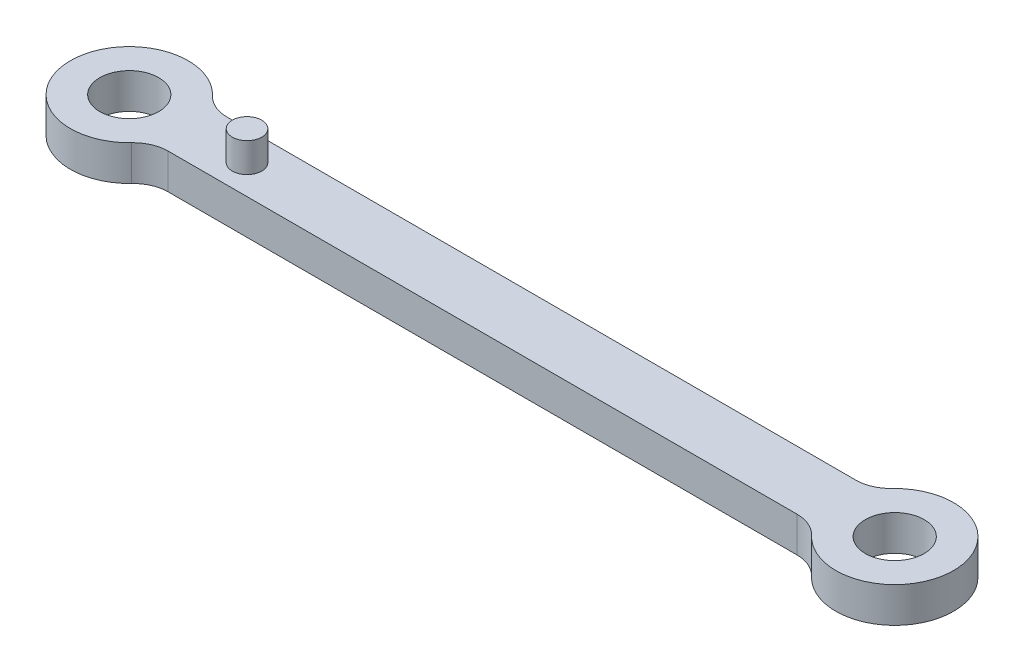
ISO-10303-21;
HEADER;
FILE_DESCRIPTION(('STEP AP214'),'2;1');
FILE_NAME('part.step','',(''),(''),'','','');
FILE_SCHEMA(('AUTOMOTIVE_DESIGN { 1 0 10303 214 1 1 1 1 }'));
ENDSEC;
DATA;
#1=APPLICATION_CONTEXT('core data for automotive mechanical design processes');
#2=APPLICATION_PROTOCOL_DEFINITION('international standard','automotive_design',2000,#1);
#3=PRODUCT_CONTEXT('',#1,'mechanical');
#4=PRODUCT('Part','Part','',(#3));
#5=PRODUCT_RELATED_PRODUCT_CATEGORY('part','',(#4));
#6=PRODUCT_DEFINITION_FORMATION('','',#4);
#7=PRODUCT_DEFINITION_CONTEXT('part definition',#1,'design');
#8=PRODUCT_DEFINITION('design','',#6,#7);
#9=PRODUCT_DEFINITION_SHAPE('','',#8);
#10=(LENGTH_UNIT() NAMED_UNIT(*) SI_UNIT(.MILLI.,.METRE.));
#11=(NAMED_UNIT(*) PLANE_ANGLE_UNIT() SI_UNIT($,.RADIAN.));
#12=(NAMED_UNIT(*) SI_UNIT($,.STERADIAN.) SOLID_ANGLE_UNIT());
#13=UNCERTAINTY_MEASURE_WITH_UNIT(LENGTH_MEASURE(1.E-05),#10,'distance_accuracy_value','');
#14=(GEOMETRIC_REPRESENTATION_CONTEXT(3) GLOBAL_UNCERTAINTY_ASSIGNED_CONTEXT((#13)) GLOBAL_UNIT_ASSIGNED_CONTEXT((#10,
#11,#12)) REPRESENTATION_CONTEXT('',''));
#15=CARTESIAN_POINT('',(0.,0.,0.));
#16=DIRECTION('',(0.,0.,1.));
#17=DIRECTION('',(1.,0.,0.));
#18=AXIS2_PLACEMENT_3D('',#15,#16,#17);
#19=CARTESIAN_POINT('',(0.,6.,0.));
#20=DIRECTION('',(0.,-1.,0.));
#21=DIRECTION('',(0.,0.,-1.));
#22=AXIS2_PLACEMENT_3D('',#19,#20,#21);
#23=CYLINDRICAL_SURFACE('',#22,10.);
#24=CARTESIAN_POINT('',(0.,6.,0.));
#25=DIRECTION('',(0.,1.,0.));
#26=DIRECTION('',(0.,0.,1.));
#27=AXIS2_PLACEMENT_3D('',#24,#25,#26);
#28=CIRCLE('',#27,10.);
#29=CARTESIAN_POINT('',(7.26184377413891,6.,-6.875));
#30=VERTEX_POINT('',#29);
#31=CARTESIAN_POINT('',(7.26184377413891,6.,6.875));
#32=VERTEX_POINT('',#31);
#33=EDGE_CURVE('E117',#30,#32,#28,.T.);
#34=ORIENTED_EDGE('',*,*,#33,.F.);
#35=DIRECTION('',(0.,-1.,0.));
#36=VECTOR('',#35,1.);
#37=CARTESIAN_POINT('',(7.26184377413891,6.,-6.875));
#38=LINE('',#37,#36);
#39=CARTESIAN_POINT('',(7.26184377413891,0.,-6.875));
#40=VERTEX_POINT('',#39);
#41=EDGE_CURVE('E104',#30,#40,#38,.T.);
#42=ORIENTED_EDGE('',*,*,#41,.T.);
#43=CARTESIAN_POINT('',(0.,0.,0.));
#44=DIRECTION('',(0.,1.,0.));
#45=DIRECTION('',(0.,0.,1.));
#46=AXIS2_PLACEMENT_3D('',#43,#44,#45);
#47=CIRCLE('',#46,10.);
#48=CARTESIAN_POINT('',(7.26184377413891,0.,6.875));
#49=VERTEX_POINT('',#48);
#50=EDGE_CURVE('E115',#40,#49,#47,.T.);
#51=ORIENTED_EDGE('',*,*,#50,.T.);
#52=DIRECTION('',(0.,-1.,0.));
#53=VECTOR('',#52,1.);
#54=CARTESIAN_POINT('',(7.26184377413891,6.,6.875));
#55=LINE('',#54,#53);
#56=EDGE_CURVE('E119',#49,#32,#55,.F.);
#57=ORIENTED_EDGE('',*,*,#56,.T.);
#58=EDGE_LOOP('',(#34,#42,#51,#57));
#59=FACE_BOUND('',#58,.T.);
#60=ADVANCED_FACE('F35',(#59),#23,.T.);
#61=CARTESIAN_POINT('',(0.,6.,5.));
#62=DIRECTION('',(0.,0.,-1.));
#63=DIRECTION('',(-1.,0.,0.));
#64=AXIS2_PLACEMENT_3D('',#61,#62,#63);
#65=PLANE('',#64);
#66=DIRECTION('',(1.,0.,0.));
#67=VECTOR('',#66,1.);
#68=CARTESIAN_POINT('',(0.,0.,5.));
#69=LINE('',#68,#67);
#70=CARTESIAN_POINT('',(11.6189500386223,0.,5.));
#71=VERTEX_POINT('',#70);
#72=CARTESIAN_POINT('',(118.381049961378,0.,5.));
#73=VERTEX_POINT('',#72);
#74=EDGE_CURVE('E123',#71,#73,#69,.T.);
#75=ORIENTED_EDGE('',*,*,#74,.T.);
#76=DIRECTION('',(0.,1.,0.));
#77=VECTOR('',#76,1.);
#78=CARTESIAN_POINT('',(118.381049961378,6.,5.));
#79=LINE('',#78,#77);
#80=CARTESIAN_POINT('',(118.381049961378,6.,5.));
#81=VERTEX_POINT('',#80);
#82=EDGE_CURVE('E50',#73,#81,#79,.T.);
#83=ORIENTED_EDGE('',*,*,#82,.T.);
#84=DIRECTION('',(1.,0.,0.));
#85=VECTOR('',#84,1.);
#86=CARTESIAN_POINT('',(0.,6.,5.));
#87=LINE('',#86,#85);
#88=CARTESIAN_POINT('',(11.6189500386223,6.,5.));
#89=VERTEX_POINT('',#88);
#90=EDGE_CURVE('E167',#89,#81,#87,.T.);
#91=ORIENTED_EDGE('',*,*,#90,.F.);
#92=DIRECTION('',(0.,1.,0.));
#93=VECTOR('',#92,1.);
#94=CARTESIAN_POINT('',(11.6189500386223,0.,5.));
#95=LINE('',#94,#93);
#96=EDGE_CURVE('E148',#89,#71,#95,.F.);
#97=ORIENTED_EDGE('',*,*,#96,.T.);
#98=EDGE_LOOP('',(#75,#83,#91,#97));
#99=FACE_BOUND('',#98,.T.);
#100=ADVANCED_FACE('F175',(#99),#65,.F.);
#101=CARTESIAN_POINT('',(130.,6.,0.));
#102=DIRECTION('',(0.,-1.,0.));
#103=DIRECTION('',(0.,0.,-1.));
#104=AXIS2_PLACEMENT_3D('',#101,#102,#103);
#105=CYLINDRICAL_SURFACE('',#104,10.);
#106=CARTESIAN_POINT('',(130.,0.,0.));
#107=DIRECTION('',(0.,1.,0.));
#108=DIRECTION('',(0.,0.,1.));
#109=AXIS2_PLACEMENT_3D('',#106,#107,#108);
#110=CIRCLE('',#109,10.);
#111=CARTESIAN_POINT('',(122.738156225861,0.,6.87500000000001));
#112=VERTEX_POINT('',#111);
#113=CARTESIAN_POINT('',(122.738156225861,0.,-6.87500000000001));
#114=VERTEX_POINT('',#113);
#115=EDGE_CURVE('E126',#112,#114,#110,.T.);
#116=ORIENTED_EDGE('',*,*,#115,.T.);
#117=DIRECTION('',(0.,-1.,0.));
#118=VECTOR('',#117,1.);
#119=CARTESIAN_POINT('',(122.738156225861,6.,-6.87500000000001));
#120=LINE('',#119,#118);
#121=CARTESIAN_POINT('',(122.738156225861,6.,-6.87500000000001));
#122=VERTEX_POINT('',#121);
#123=EDGE_CURVE('E146',#114,#122,#120,.F.);
#124=ORIENTED_EDGE('',*,*,#123,.T.);
#125=CARTESIAN_POINT('',(130.,6.,0.));
#126=DIRECTION('',(0.,1.,0.));
#127=DIRECTION('',(0.,0.,1.));
#128=AXIS2_PLACEMENT_3D('',#125,#126,#127);
#129=CIRCLE('',#128,10.);
#130=CARTESIAN_POINT('',(122.738156225861,6.,6.87500000000001));
#131=VERTEX_POINT('',#130);
#132=EDGE_CURVE('E165',#131,#122,#129,.T.);
#133=ORIENTED_EDGE('',*,*,#132,.F.);
#134=DIRECTION('',(0.,-1.,0.));
#135=VECTOR('',#134,1.);
#136=CARTESIAN_POINT('',(122.738156225861,6.,6.87500000000001));
#137=LINE('',#136,#135);
#138=EDGE_CURVE('E143',#131,#112,#137,.T.);
#139=ORIENTED_EDGE('',*,*,#138,.T.);
#140=EDGE_LOOP('',(#116,#124,#133,#139));
#141=FACE_BOUND('',#140,.T.);
#142=ADVANCED_FACE('F171',(#141),#105,.T.);
#143=CARTESIAN_POINT('',(0.,6.,-5.));
#144=DIRECTION('',(0.,0.,-1.));
#145=DIRECTION('',(-1.,0.,0.));
#146=AXIS2_PLACEMENT_3D('',#143,#144,#145);
#147=PLANE('',#146);
#148=DIRECTION('',(1.,0.,0.));
#149=VECTOR('',#148,1.);
#150=CARTESIAN_POINT('',(0.,0.,-5.));
#151=LINE('',#150,#149);
#152=CARTESIAN_POINT('',(11.6189500386223,0.,-5.));
#153=VERTEX_POINT('',#152);
#154=CARTESIAN_POINT('',(118.381049961378,0.,-5.));
#155=VERTEX_POINT('',#154);
#156=EDGE_CURVE('E137',#153,#155,#151,.T.);
#157=ORIENTED_EDGE('',*,*,#156,.F.);
#158=DIRECTION('',(0.,-1.,0.));
#159=VECTOR('',#158,1.);
#160=CARTESIAN_POINT('',(11.6189500386223,6.,-5.));
#161=LINE('',#160,#159);
#162=CARTESIAN_POINT('',(11.6189500386223,6.,-5.));
#163=VERTEX_POINT('',#162);
#164=EDGE_CURVE('E105',#153,#163,#161,.F.);
#165=ORIENTED_EDGE('',*,*,#164,.T.);
#166=DIRECTION('',(1.,0.,0.));
#167=VECTOR('',#166,1.);
#168=CARTESIAN_POINT('',(0.,6.,-5.));
#169=LINE('',#168,#167);
#170=CARTESIAN_POINT('',(118.381049961378,6.,-5.));
#171=VERTEX_POINT('',#170);
#172=EDGE_CURVE('E132',#163,#171,#169,.T.);
#173=ORIENTED_EDGE('',*,*,#172,.T.);
#174=DIRECTION('',(0.,-1.,0.));
#175=VECTOR('',#174,1.);
#176=CARTESIAN_POINT('',(118.381049961378,6.,-5.));
#177=LINE('',#176,#175);
#178=EDGE_CURVE('E118',#171,#155,#177,.T.);
#179=ORIENTED_EDGE('',*,*,#178,.T.);
#180=EDGE_LOOP('',(#157,#165,#173,#179));
#181=FACE_BOUND('',#180,.T.);
#182=ADVANCED_FACE('F207',(#181),#147,.T.);
#183=CARTESIAN_POINT('',(0.,6.,0.));
#184=DIRECTION('',(0.,1.,0.));
#185=DIRECTION('',(0.,0.,1.));
#186=AXIS2_PLACEMENT_3D('',#183,#184,#185);
#187=PLANE('',#186);
#188=CARTESIAN_POINT('',(20.,6.,0.));
#189=DIRECTION('',(0.,1.,0.));
#190=DIRECTION('',(0.,0.,1.));
#191=AXIS2_PLACEMENT_3D('',#188,#189,#190);
#192=CIRCLE('',#191,2.5);
#193=CARTESIAN_POINT('',(20.,6.,2.5));
#194=VERTEX_POINT('',#193);
#195=EDGE_CURVE('E190',#194,#194,#192,.T.);
#196=ORIENTED_EDGE('',*,*,#195,.F.);
#197=EDGE_LOOP('',(#196));
#198=FACE_BOUND('',#197,.T.);
#199=CARTESIAN_POINT('',(0.,6.,0.));
#200=DIRECTION('',(0.,1.,0.));
#201=DIRECTION('',(0.,0.,1.));
#202=AXIS2_PLACEMENT_3D('',#199,#200,#201);
#203=CIRCLE('',#202,5.);
#204=CARTESIAN_POINT('',(0.,6.,5.));
#205=VERTEX_POINT('',#204);
#206=EDGE_CURVE('E129',#205,#205,#203,.T.);
#207=ORIENTED_EDGE('',*,*,#206,.F.);
#208=EDGE_LOOP('',(#207));
#209=FACE_BOUND('',#208,.T.);
#210=CARTESIAN_POINT('',(130.,6.,0.));
#211=DIRECTION('',(0.,1.,0.));
#212=DIRECTION('',(0.,0.,1.));
#213=AXIS2_PLACEMENT_3D('',#210,#211,#212);
#214=CIRCLE('',#213,4.99999999999999);
#215=CARTESIAN_POINT('',(130.,6.,4.99999999999999));
#216=VERTEX_POINT('',#215);
#217=EDGE_CURVE('E184',#216,#216,#214,.T.);
#218=ORIENTED_EDGE('',*,*,#217,.F.);
#219=EDGE_LOOP('',(#218));
#220=FACE_BOUND('',#219,.T.);
#221=ORIENTED_EDGE('',*,*,#172,.F.);
#222=CARTESIAN_POINT('',(11.6189500386223,6.,-11.));
#223=DIRECTION('',(0.,1.,0.));
#224=DIRECTION('',(0.,0.,1.));
#225=AXIS2_PLACEMENT_3D('',#222,#223,#224);
#226=CIRCLE('',#225,6.);
#227=EDGE_CURVE('E110',#163,#30,#226,.F.);
#228=ORIENTED_EDGE('',*,*,#227,.T.);
#229=ORIENTED_EDGE('',*,*,#33,.T.);
#230=CARTESIAN_POINT('',(11.6189500386223,6.,11.));
#231=DIRECTION('',(0.,1.,0.));
#232=DIRECTION('',(0.,0.,1.));
#233=AXIS2_PLACEMENT_3D('',#230,#231,#232);
#234=CIRCLE('',#233,6.);
#235=EDGE_CURVE('E11',#32,#89,#234,.F.);
#236=ORIENTED_EDGE('',*,*,#235,.T.);
#237=ORIENTED_EDGE('',*,*,#90,.T.);
#238=CARTESIAN_POINT('',(118.381049961378,6.,11.));
#239=DIRECTION('',(0.,1.,0.));
#240=DIRECTION('',(0.,0.,1.));
#241=AXIS2_PLACEMENT_3D('',#238,#239,#240);
#242=CIRCLE('',#241,6.);
#243=EDGE_CURVE('E159',#81,#131,#242,.F.);
#244=ORIENTED_EDGE('',*,*,#243,.T.);
#245=ORIENTED_EDGE('',*,*,#132,.T.);
#246=CARTESIAN_POINT('',(118.381049961378,6.,-11.));
#247=DIRECTION('',(0.,1.,0.));
#248=DIRECTION('',(0.,0.,1.));
#249=AXIS2_PLACEMENT_3D('',#246,#247,#248);
#250=CIRCLE('',#249,6.);
#251=EDGE_CURVE('E155',#122,#171,#250,.F.);
#252=ORIENTED_EDGE('',*,*,#251,.T.);
#253=EDGE_LOOP('',(#221,#228,#229,#236,#237,#244,#245,#252));
#254=FACE_BOUND('',#253,.T.);
#255=ADVANCED_FACE('F164',(#198,#209,#220,#254),#187,.T.);
#256=CARTESIAN_POINT('',(0.,0.,0.));
#257=DIRECTION('',(0.,1.,0.));
#258=DIRECTION('',(0.,0.,1.));
#259=AXIS2_PLACEMENT_3D('',#256,#257,#258);
#260=PLANE('',#259);
#261=CARTESIAN_POINT('',(0.,0.,0.));
#262=DIRECTION('',(0.,1.,0.));
#263=DIRECTION('',(0.,0.,1.));
#264=AXIS2_PLACEMENT_3D('',#261,#262,#263);
#265=CIRCLE('',#264,5.);
#266=CARTESIAN_POINT('',(0.,0.,5.));
#267=VERTEX_POINT('',#266);
#268=EDGE_CURVE('E124',#267,#267,#265,.T.);
#269=ORIENTED_EDGE('',*,*,#268,.T.);
#270=EDGE_LOOP('',(#269));
#271=FACE_BOUND('',#270,.T.);
#272=CARTESIAN_POINT('',(130.,0.,0.));
#273=DIRECTION('',(0.,1.,0.));
#274=DIRECTION('',(0.,0.,1.));
#275=AXIS2_PLACEMENT_3D('',#272,#273,#274);
#276=CIRCLE('',#275,4.99999999999999);
#277=CARTESIAN_POINT('',(130.,0.,4.99999999999999));
#278=VERTEX_POINT('',#277);
#279=EDGE_CURVE('E181',#278,#278,#276,.T.);
#280=ORIENTED_EDGE('',*,*,#279,.T.);
#281=EDGE_LOOP('',(#280));
#282=FACE_BOUND('',#281,.T.);
#283=ORIENTED_EDGE('',*,*,#50,.F.);
#284=CARTESIAN_POINT('',(11.6189500386223,0.,-11.));
#285=DIRECTION('',(0.,1.,0.));
#286=DIRECTION('',(0.,0.,1.));
#287=AXIS2_PLACEMENT_3D('',#284,#285,#286);
#288=CIRCLE('',#287,6.);
#289=EDGE_CURVE('E100',#40,#153,#288,.T.);
#290=ORIENTED_EDGE('',*,*,#289,.T.);
#291=ORIENTED_EDGE('',*,*,#156,.T.);
#292=CARTESIAN_POINT('',(118.381049961378,0.,-11.));
#293=DIRECTION('',(0.,1.,0.));
#294=DIRECTION('',(0.,0.,1.));
#295=AXIS2_PLACEMENT_3D('',#292,#293,#294);
#296=CIRCLE('',#295,6.);
#297=EDGE_CURVE('E153',#155,#114,#296,.T.);
#298=ORIENTED_EDGE('',*,*,#297,.T.);
#299=ORIENTED_EDGE('',*,*,#115,.F.);
#300=CARTESIAN_POINT('',(118.381049961378,0.,11.));
#301=DIRECTION('',(0.,1.,0.));
#302=DIRECTION('',(0.,0.,1.));
#303=AXIS2_PLACEMENT_3D('',#300,#301,#302);
#304=CIRCLE('',#303,6.);
#305=EDGE_CURVE('E157',#112,#73,#304,.T.);
#306=ORIENTED_EDGE('',*,*,#305,.T.);
#307=ORIENTED_EDGE('',*,*,#74,.F.);
#308=CARTESIAN_POINT('',(11.6189500386223,0.,11.));
#309=DIRECTION('',(0.,1.,0.));
#310=DIRECTION('',(0.,0.,1.));
#311=AXIS2_PLACEMENT_3D('',#308,#309,#310);
#312=CIRCLE('',#311,6.);
#313=EDGE_CURVE('E43',#71,#49,#312,.T.);
#314=ORIENTED_EDGE('',*,*,#313,.T.);
#315=EDGE_LOOP('',(#283,#290,#291,#298,#299,#306,#307,#314));
#316=FACE_BOUND('',#315,.T.);
#317=ADVANCED_FACE('F121',(#271,#282,#316),#260,.F.);
#318=CARTESIAN_POINT('',(11.6189500386223,6.,-11.));
#319=DIRECTION('',(0.,-1.,0.));
#320=DIRECTION('',(0.,0.,-1.));
#321=AXIS2_PLACEMENT_3D('',#318,#319,#320);
#322=CYLINDRICAL_SURFACE('',#321,6.);
#323=ORIENTED_EDGE('',*,*,#227,.F.);
#324=ORIENTED_EDGE('',*,*,#164,.F.);
#325=ORIENTED_EDGE('',*,*,#289,.F.);
#326=ORIENTED_EDGE('',*,*,#41,.F.);
#327=EDGE_LOOP('',(#323,#324,#325,#326));
#328=FACE_BOUND('',#327,.T.);
#329=ADVANCED_FACE('F103',(#328),#322,.F.);
#330=CARTESIAN_POINT('',(118.381049961378,6.,-11.));
#331=DIRECTION('',(0.,-1.,0.));
#332=DIRECTION('',(0.,0.,-1.));
#333=AXIS2_PLACEMENT_3D('',#330,#331,#332);
#334=CYLINDRICAL_SURFACE('',#333,6.);
#335=ORIENTED_EDGE('',*,*,#251,.F.);
#336=ORIENTED_EDGE('',*,*,#123,.F.);
#337=ORIENTED_EDGE('',*,*,#297,.F.);
#338=ORIENTED_EDGE('',*,*,#178,.F.);
#339=EDGE_LOOP('',(#335,#336,#337,#338));
#340=FACE_BOUND('',#339,.T.);
#341=ADVANCED_FACE('F234',(#340),#334,.F.);
#342=CARTESIAN_POINT('',(118.381049961378,6.,11.));
#343=DIRECTION('',(0.,-1.,0.));
#344=DIRECTION('',(0.,0.,-1.));
#345=AXIS2_PLACEMENT_3D('',#342,#343,#344);
#346=CYLINDRICAL_SURFACE('',#345,6.);
#347=ORIENTED_EDGE('',*,*,#243,.F.);
#348=ORIENTED_EDGE('',*,*,#82,.F.);
#349=ORIENTED_EDGE('',*,*,#305,.F.);
#350=ORIENTED_EDGE('',*,*,#138,.F.);
#351=EDGE_LOOP('',(#347,#348,#349,#350));
#352=FACE_BOUND('',#351,.T.);
#353=ADVANCED_FACE('F174',(#352),#346,.F.);
#354=CARTESIAN_POINT('',(11.6189500386223,6.,11.));
#355=DIRECTION('',(0.,-1.,0.));
#356=DIRECTION('',(0.,0.,-1.));
#357=AXIS2_PLACEMENT_3D('',#354,#355,#356);
#358=CYLINDRICAL_SURFACE('',#357,6.);
#359=ORIENTED_EDGE('',*,*,#235,.F.);
#360=ORIENTED_EDGE('',*,*,#56,.F.);
#361=ORIENTED_EDGE('',*,*,#313,.F.);
#362=ORIENTED_EDGE('',*,*,#96,.F.);
#363=EDGE_LOOP('',(#359,#360,#361,#362));
#364=FACE_BOUND('',#363,.T.);
#365=ADVANCED_FACE('F37',(#364),#358,.F.);
#366=CARTESIAN_POINT('',(130.,0.,0.));
#367=DIRECTION('',(0.,1.,0.));
#368=DIRECTION('',(0.,0.,1.));
#369=AXIS2_PLACEMENT_3D('',#366,#367,#368);
#370=CYLINDRICAL_SURFACE('',#369,4.99999999999999);
#371=ORIENTED_EDGE('',*,*,#279,.F.);
#372=EDGE_LOOP('',(#371));
#373=FACE_BOUND('',#372,.T.);
#374=ORIENTED_EDGE('',*,*,#217,.T.);
#375=EDGE_LOOP('',(#374));
#376=FACE_BOUND('',#375,.T.);
#377=ADVANCED_FACE('F213',(#373,#376),#370,.F.);
#378=CARTESIAN_POINT('',(0.,0.,0.));
#379=DIRECTION('',(0.,1.,0.));
#380=DIRECTION('',(0.,0.,1.));
#381=AXIS2_PLACEMENT_3D('',#378,#379,#380);
#382=CYLINDRICAL_SURFACE('',#381,5.);
#383=ORIENTED_EDGE('',*,*,#268,.F.);
#384=EDGE_LOOP('',(#383));
#385=FACE_BOUND('',#384,.T.);
#386=ORIENTED_EDGE('',*,*,#206,.T.);
#387=EDGE_LOOP('',(#386));
#388=FACE_BOUND('',#387,.T.);
#389=ADVANCED_FACE('F201',(#385,#388),#382,.F.);
#390=CARTESIAN_POINT('',(20.,11.,0.));
#391=DIRECTION('',(0.,-1.,0.));
#392=DIRECTION('',(0.,0.,-1.));
#393=AXIS2_PLACEMENT_3D('',#390,#391,#392);
#394=CYLINDRICAL_SURFACE('',#393,2.5);
#395=CARTESIAN_POINT('',(20.,11.,0.));
#396=DIRECTION('',(0.,1.,0.));
#397=DIRECTION('',(0.,0.,1.));
#398=AXIS2_PLACEMENT_3D('',#395,#396,#397);
#399=CIRCLE('',#398,2.5);
#400=CARTESIAN_POINT('',(20.,11.,2.5));
#401=VERTEX_POINT('',#400);
#402=EDGE_CURVE('E185',#401,#401,#399,.T.);
#403=ORIENTED_EDGE('',*,*,#402,.F.);
#404=EDGE_LOOP('',(#403));
#405=FACE_BOUND('',#404,.T.);
#406=ORIENTED_EDGE('',*,*,#195,.T.);
#407=EDGE_LOOP('',(#406));
#408=FACE_BOUND('',#407,.T.);
#409=ADVANCED_FACE('F198',(#405,#408),#394,.T.);
#410=CARTESIAN_POINT('',(0.,11.,0.));
#411=DIRECTION('',(0.,1.,0.));
#412=DIRECTION('',(0.,0.,1.));
#413=AXIS2_PLACEMENT_3D('',#410,#411,#412);
#414=PLANE('',#413);
#415=ORIENTED_EDGE('',*,*,#402,.T.);
#416=EDGE_LOOP('',(#415));
#417=FACE_BOUND('',#416,.T.);
#418=ADVANCED_FACE('F196',(#417),#414,.T.);
#419=CLOSED_SHELL('',(#60,#100,#142,#182,#255,#317,#329,#341,#353,#365,#377,#389,#409,#418));
#420=MANIFOLD_SOLID_BREP('B2',#419);
#421=ADVANCED_BREP_SHAPE_REPRESENTATION('',(#18,#420),#14);
#422=SHAPE_DEFINITION_REPRESENTATION(#9,#421);
ENDSEC;
END-ISO-10303-21;
